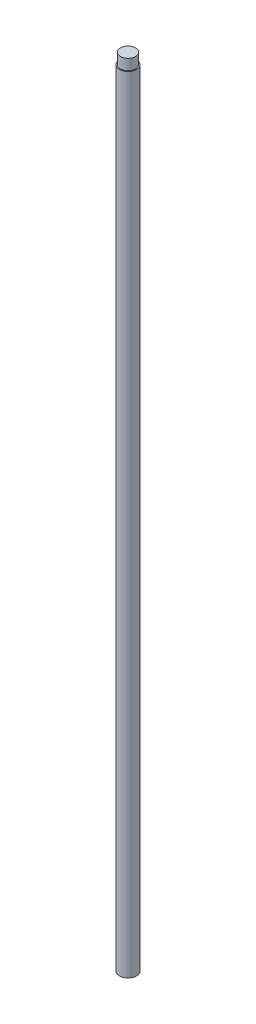
ISO-10303-21;
HEADER;
FILE_DESCRIPTION(('STEP AP214'),'2;1');
FILE_NAME('part.step','',(''),(''),'','','');
FILE_SCHEMA(('AUTOMOTIVE_DESIGN { 1 0 10303 214 1 1 1 1 }'));
ENDSEC;
DATA;
#1=APPLICATION_CONTEXT('core data for automotive mechanical design processes');
#2=APPLICATION_PROTOCOL_DEFINITION('international standard','automotive_design',2000,#1);
#3=PRODUCT_CONTEXT('',#1,'mechanical');
#4=PRODUCT('Part','Part','',(#3));
#5=PRODUCT_RELATED_PRODUCT_CATEGORY('part','',(#4));
#6=PRODUCT_DEFINITION_FORMATION('','',#4);
#7=PRODUCT_DEFINITION_CONTEXT('part definition',#1,'design');
#8=PRODUCT_DEFINITION('design','',#6,#7);
#9=PRODUCT_DEFINITION_SHAPE('','',#8);
#10=(LENGTH_UNIT() NAMED_UNIT(*) SI_UNIT(.MILLI.,.METRE.));
#11=(NAMED_UNIT(*) PLANE_ANGLE_UNIT() SI_UNIT($,.RADIAN.));
#12=(NAMED_UNIT(*) SI_UNIT($,.STERADIAN.) SOLID_ANGLE_UNIT());
#13=UNCERTAINTY_MEASURE_WITH_UNIT(LENGTH_MEASURE(1.E-05),#10,'distance_accuracy_value','');
#14=(GEOMETRIC_REPRESENTATION_CONTEXT(3) GLOBAL_UNCERTAINTY_ASSIGNED_CONTEXT((#13)) GLOBAL_UNIT_ASSIGNED_CONTEXT((#10,
#11,#12)) REPRESENTATION_CONTEXT('',''));
#15=CARTESIAN_POINT('',(0.,0.,0.));
#16=DIRECTION('',(0.,0.,1.));
#17=DIRECTION('',(1.,0.,0.));
#18=AXIS2_PLACEMENT_3D('',#15,#16,#17);
#19=CARTESIAN_POINT('',(0.,365.,0.));
#20=DIRECTION('',(0.,-1.,0.));
#21=DIRECTION('',(0.,0.,-1.));
#22=AXIS2_PLACEMENT_3D('',#19,#20,#21);
#23=CYLINDRICAL_SURFACE('',#22,4.);
#24=CARTESIAN_POINT('',(0.,365.,0.));
#25=DIRECTION('',(0.,1.,0.));
#26=DIRECTION('',(0.,0.,1.));
#27=AXIS2_PLACEMENT_3D('',#24,#25,#26);
#28=CIRCLE('',#27,4.);
#29=CARTESIAN_POINT('',(0.,365.,-4.));
#30=VERTEX_POINT('',#29);
#31=EDGE_CURVE('E44',#30,#30,#28,.T.);
#32=CARTESIAN_POINT('',(0.,0.,0.));
#33=DIRECTION('',(0.,1.,0.));
#34=DIRECTION('',(0.,0.,1.));
#35=AXIS2_PLACEMENT_3D('',#32,#33,#34);
#36=CIRCLE('',#35,4.);
#37=CARTESIAN_POINT('',(0.,0.,-4.));
#38=VERTEX_POINT('',#37);
#39=EDGE_CURVE('E40',#38,#38,#36,.T.);
#40=CARTESIAN_POINT('',(0.,365.,-4.));
#41=CARTESIAN_POINT('',(0.,361.197916666667,-4.));
#42=CARTESIAN_POINT('',(0.,357.395833333333,-4.));
#43=CARTESIAN_POINT('',(0.,349.791666666667,-4.));
#44=CARTESIAN_POINT('',(0.,345.989583333333,-4.));
#45=CARTESIAN_POINT('',(0.,338.385416666667,-4.));
#46=CARTESIAN_POINT('',(0.,334.583333333333,-4.));
#47=CARTESIAN_POINT('',(0.,326.979166666667,-4.));
#48=CARTESIAN_POINT('',(0.,323.177083333333,-4.));
#49=CARTESIAN_POINT('',(0.,315.572916666667,-4.));
#50=CARTESIAN_POINT('',(0.,311.770833333333,-4.));
#51=CARTESIAN_POINT('',(0.,304.166666666667,-4.));
#52=CARTESIAN_POINT('',(0.,300.364583333333,-4.));
#53=CARTESIAN_POINT('',(0.,292.760416666667,-4.));
#54=CARTESIAN_POINT('',(0.,288.958333333333,-4.));
#55=CARTESIAN_POINT('',(0.,281.354166666667,-4.));
#56=CARTESIAN_POINT('',(0.,277.552083333333,-4.));
#57=CARTESIAN_POINT('',(0.,269.947916666667,-4.));
#58=CARTESIAN_POINT('',(0.,266.145833333333,-4.));
#59=CARTESIAN_POINT('',(0.,258.541666666667,-4.));
#60=CARTESIAN_POINT('',(0.,254.739583333333,-4.));
#61=CARTESIAN_POINT('',(0.,247.135416666667,-4.));
#62=CARTESIAN_POINT('',(0.,243.333333333333,-4.));
#63=CARTESIAN_POINT('',(0.,235.729166666667,-4.));
#64=CARTESIAN_POINT('',(0.,231.927083333333,-4.));
#65=CARTESIAN_POINT('',(0.,224.322916666667,-4.));
#66=CARTESIAN_POINT('',(0.,220.520833333333,-4.));
#67=CARTESIAN_POINT('',(0.,212.916666666667,-4.));
#68=CARTESIAN_POINT('',(0.,209.114583333333,-4.));
#69=CARTESIAN_POINT('',(0.,201.510416666667,-4.));
#70=CARTESIAN_POINT('',(0.,197.708333333333,-4.));
#71=CARTESIAN_POINT('',(0.,190.104166666667,-4.));
#72=CARTESIAN_POINT('',(0.,186.302083333333,-4.));
#73=CARTESIAN_POINT('',(0.,178.697916666667,-4.));
#74=CARTESIAN_POINT('',(0.,174.895833333333,-4.));
#75=CARTESIAN_POINT('',(0.,167.291666666667,-4.));
#76=CARTESIAN_POINT('',(0.,163.489583333333,-4.));
#77=CARTESIAN_POINT('',(0.,155.885416666667,-4.));
#78=CARTESIAN_POINT('',(0.,152.083333333333,-4.));
#79=CARTESIAN_POINT('',(0.,144.479166666667,-4.));
#80=CARTESIAN_POINT('',(0.,140.677083333333,-4.));
#81=CARTESIAN_POINT('',(0.,133.072916666667,-4.));
#82=CARTESIAN_POINT('',(0.,129.270833333333,-4.));
#83=CARTESIAN_POINT('',(0.,121.666666666667,-4.));
#84=CARTESIAN_POINT('',(0.,117.864583333333,-4.));
#85=CARTESIAN_POINT('',(0.,110.260416666667,-4.));
#86=CARTESIAN_POINT('',(0.,106.458333333333,-4.));
#87=CARTESIAN_POINT('',(0.,98.8541666666666,-4.));
#88=CARTESIAN_POINT('',(0.,95.0520833333333,-4.));
#89=CARTESIAN_POINT('',(0.,87.4479166666666,-4.));
#90=CARTESIAN_POINT('',(0.,83.6458333333333,-4.));
#91=CARTESIAN_POINT('',(0.,76.0416666666666,-4.));
#92=CARTESIAN_POINT('',(0.,72.2395833333333,-4.));
#93=CARTESIAN_POINT('',(0.,64.6354166666666,-4.));
#94=CARTESIAN_POINT('',(0.,60.8333333333333,-4.));
#95=CARTESIAN_POINT('',(0.,53.2291666666666,-4.));
#96=CARTESIAN_POINT('',(0.,49.4270833333333,-4.));
#97=CARTESIAN_POINT('',(0.,41.8229166666666,-4.));
#98=CARTESIAN_POINT('',(0.,38.0208333333333,-4.));
#99=CARTESIAN_POINT('',(0.,30.4166666666666,-4.));
#100=CARTESIAN_POINT('',(0.,26.6145833333333,-4.));
#101=CARTESIAN_POINT('',(0.,19.0104166666666,-4.));
#102=CARTESIAN_POINT('',(0.,15.2083333333333,-4.));
#103=CARTESIAN_POINT('',(0.,7.60416666666662,-4.));
#104=CARTESIAN_POINT('',(0.,3.80208333333328,-4.));
#105=CARTESIAN_POINT('',(0.,0.,-4.));
#106=B_SPLINE_CURVE_WITH_KNOTS('',3,(#40,#41,#42,#43,#44,#45,#46,#47,#48,#49,#50,#51,#52,#53,
#54,#55,#56,#57,#58,#59,#60,#61,#62,#63,#64,#65,#66,#67,#68,#69,#70,#71,#72,#73,#74,#75,#76,#77,
#78,#79,#80,#81,#82,#83,#84,#85,#86,#87,#88,#89,#90,#91,#92,#93,#94,#95,#96,#97,#98,#99,#100,
#101,#102,#103,#104,#105),.UNSPECIFIED.,.F.,.F.,(4,2,2,2,2,2,2,2,2,2,2,2,2,2,2,2,2,2,2,2,2,2,2,
2,2,2,2,2,2,2,2,2,4),(0.,11.40625,22.8125,34.21875,45.625,57.03125,68.4375,79.8437499999999,
91.25,102.65625,114.0625,125.46875,136.875,148.28125,159.6875,171.09375,182.5,193.90625,
205.3125,216.71875,228.125,239.53125,250.9375,262.34375,273.75,285.15625,296.5625,307.96875,
319.375,330.78125,342.1875,353.59375,365.),.UNSPECIFIED.);
#107=EDGE_CURVE('BSEAM37',#30,#38,#106,.T.);
#108=ORIENTED_EDGE('',*,*,#31,.F.);
#109=ORIENTED_EDGE('',*,*,#39,.T.);
#110=ORIENTED_EDGE('',*,*,#107,.T.);
#111=ORIENTED_EDGE('',*,*,#107,.F.);
#112=EDGE_LOOP('',(#108,#110,#109,#111));
#113=FACE_BOUND('',#112,.T.);
#114=ADVANCED_FACE('F37',(#113),#23,.T.);
#115=CARTESIAN_POINT('',(0.,365.,0.));
#116=DIRECTION('',(0.,1.,0.));
#117=DIRECTION('',(0.,0.,1.));
#118=AXIS2_PLACEMENT_3D('',#115,#116,#117);
#119=PLANE('',#118);
#120=CARTESIAN_POINT('',(0.,365.,0.));
#121=DIRECTION('',(0.,1.,0.));
#122=DIRECTION('',(0.,0.,1.));
#123=AXIS2_PLACEMENT_3D('',#120,#121,#122);
#124=CIRCLE('',#123,3.5);
#125=CARTESIAN_POINT('',(0.,365.,3.5));
#126=VERTEX_POINT('',#125);
#127=EDGE_CURVE('E10',#126,#126,#124,.T.);
#128=ORIENTED_EDGE('',*,*,#127,.F.);
#129=EDGE_LOOP('',(#128));
#130=FACE_BOUND('',#129,.T.);
#131=ORIENTED_EDGE('',*,*,#31,.T.);
#132=EDGE_LOOP('',(#131));
#133=FACE_BOUND('',#132,.T.);
#134=ADVANCED_FACE('F61',(#130,#133),#119,.T.);
#135=CARTESIAN_POINT('',(0.,0.,0.));
#136=DIRECTION('',(0.,1.,0.));
#137=DIRECTION('',(0.,0.,1.));
#138=AXIS2_PLACEMENT_3D('',#135,#136,#137);
#139=PLANE('',#138);
#140=ORIENTED_EDGE('',*,*,#39,.F.);
#141=EDGE_LOOP('',(#140));
#142=FACE_BOUND('',#141,.T.);
#143=ADVANCED_FACE('F58',(#142),#139,.F.);
#144=CARTESIAN_POINT('',(0.,370.,0.));
#145=DIRECTION('',(0.,-1.,0.));
#146=DIRECTION('',(0.,0.,-1.));
#147=AXIS2_PLACEMENT_3D('',#144,#145,#146);
#148=CYLINDRICAL_SURFACE('',#147,3.5);
#149=CARTESIAN_POINT('',(0.,370.,0.));
#150=DIRECTION('',(0.,1.,0.));
#151=DIRECTION('',(0.,0.,1.));
#152=AXIS2_PLACEMENT_3D('',#149,#150,#151);
#153=CIRCLE('',#152,3.5);
#154=CARTESIAN_POINT('',(0.,370.,3.5));
#155=VERTEX_POINT('',#154);
#156=EDGE_CURVE('E50',#155,#155,#153,.T.);
#157=ORIENTED_EDGE('',*,*,#156,.F.);
#158=EDGE_LOOP('',(#157));
#159=FACE_BOUND('',#158,.T.);
#160=ORIENTED_EDGE('',*,*,#127,.T.);
#161=EDGE_LOOP('',(#160));
#162=FACE_BOUND('',#161,.T.);
#163=ADVANCED_FACE('F60',(#159,#162),#148,.T.);
#164=CARTESIAN_POINT('',(0.,370.,0.));
#165=DIRECTION('',(0.,1.,0.));
#166=DIRECTION('',(0.,0.,1.));
#167=AXIS2_PLACEMENT_3D('',#164,#165,#166);
#168=PLANE('',#167);
#169=ORIENTED_EDGE('',*,*,#156,.T.);
#170=EDGE_LOOP('',(#169));
#171=FACE_BOUND('',#170,.T.);
#172=ADVANCED_FACE('F66',(#171),#168,.T.);
#173=CLOSED_SHELL('',(#114,#134,#143,#163,#172));
#174=MANIFOLD_SOLID_BREP('B2',#173);
#175=ADVANCED_BREP_SHAPE_REPRESENTATION('',(#18,#174),#14);
#176=SHAPE_DEFINITION_REPRESENTATION(#9,#175);
ENDSEC;
END-ISO-10303-21;
